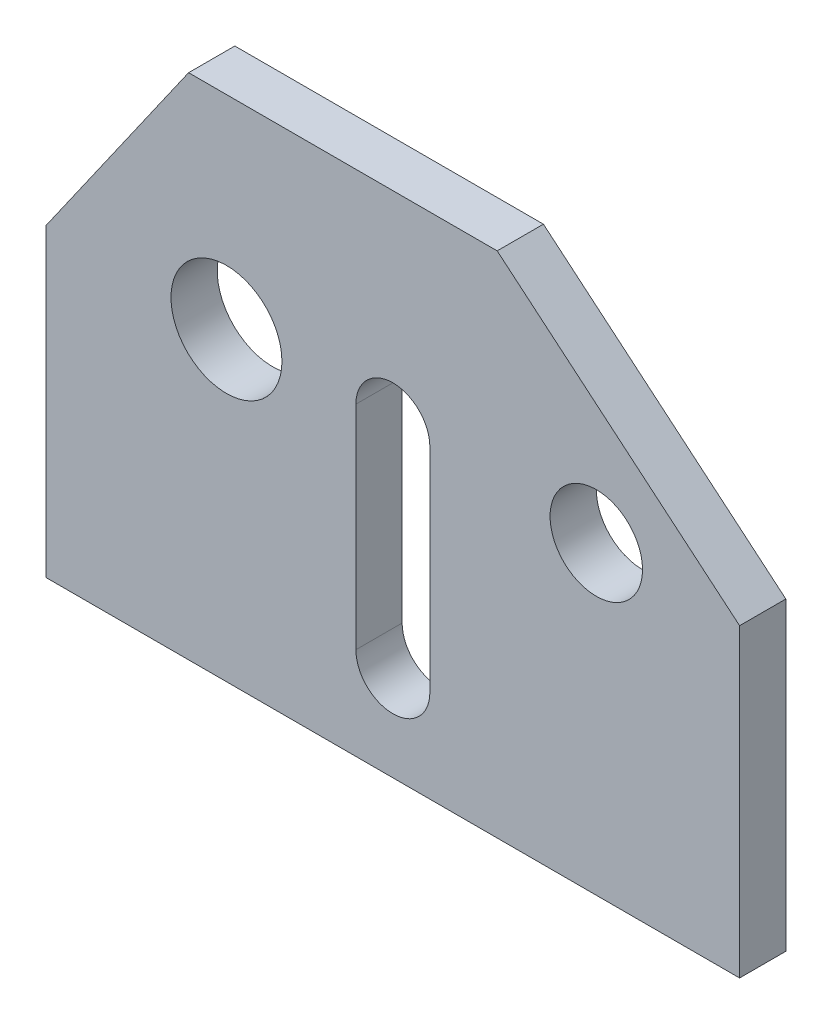
ISO-10303-21;
HEADER;
FILE_DESCRIPTION(('STEP AP214'),'2;1');
FILE_NAME('part.step','',(''),(''),'','','');
FILE_SCHEMA(('AUTOMOTIVE_DESIGN { 1 0 10303 214 1 1 1 1 }'));
ENDSEC;
DATA;
#1=APPLICATION_CONTEXT('core data for automotive mechanical design processes');
#2=APPLICATION_PROTOCOL_DEFINITION('international standard','automotive_design',2000,#1);
#3=PRODUCT_CONTEXT('',#1,'mechanical');
#4=PRODUCT('Part','Part','',(#3));
#5=PRODUCT_RELATED_PRODUCT_CATEGORY('part','',(#4));
#6=PRODUCT_DEFINITION_FORMATION('','',#4);
#7=PRODUCT_DEFINITION_CONTEXT('part definition',#1,'design');
#8=PRODUCT_DEFINITION('design','',#6,#7);
#9=PRODUCT_DEFINITION_SHAPE('','',#8);
#10=(LENGTH_UNIT() NAMED_UNIT(*) SI_UNIT(.MILLI.,.METRE.));
#11=(NAMED_UNIT(*) PLANE_ANGLE_UNIT() SI_UNIT($,.RADIAN.));
#12=(NAMED_UNIT(*) SI_UNIT($,.STERADIAN.) SOLID_ANGLE_UNIT());
#13=UNCERTAINTY_MEASURE_WITH_UNIT(LENGTH_MEASURE(1.E-05),#10,'distance_accuracy_value','');
#14=(GEOMETRIC_REPRESENTATION_CONTEXT(3) GLOBAL_UNCERTAINTY_ASSIGNED_CONTEXT((#13)) GLOBAL_UNIT_ASSIGNED_CONTEXT((#10,
#11,#12)) REPRESENTATION_CONTEXT('',''));
#15=CARTESIAN_POINT('',(0.,0.,0.));
#16=DIRECTION('',(0.,0.,1.));
#17=DIRECTION('',(1.,0.,0.));
#18=AXIS2_PLACEMENT_3D('',#15,#16,#17);
#19=CARTESIAN_POINT('',(0.,0.,5.));
#20=DIRECTION('',(0.,0.,1.));
#21=DIRECTION('',(1.,0.,0.));
#22=AXIS2_PLACEMENT_3D('',#19,#20,#21);
#23=PLANE('',#22);
#24=CARTESIAN_POINT('',(19.5,33.,5.));
#25=DIRECTION('',(0.,0.,1.));
#26=DIRECTION('',(1.,0.,0.));
#27=AXIS2_PLACEMENT_3D('',#24,#25,#26);
#28=CIRCLE('',#27,6.);
#29=CARTESIAN_POINT('',(25.5,33.,5.));
#30=VERTEX_POINT('',#29);
#31=EDGE_CURVE('E158',#30,#30,#28,.T.);
#32=ORIENTED_EDGE('',*,*,#31,.F.);
#33=EDGE_LOOP('',(#32));
#34=FACE_BOUND('',#33,.T.);
#35=DIRECTION('',(0.,-1.,0.));
#36=VECTOR('',#35,1.);
#37=CARTESIAN_POINT('',(0.,0.,5.));
#38=LINE('',#37,#36);
#39=CARTESIAN_POINT('',(0.,33.,5.));
#40=VERTEX_POINT('',#39);
#41=CARTESIAN_POINT('',(0.,0.,5.));
#42=VERTEX_POINT('',#41);
#43=EDGE_CURVE('E168',#40,#42,#38,.T.);
#44=ORIENTED_EDGE('',*,*,#43,.T.);
#45=DIRECTION('',(1.,0.,0.));
#46=VECTOR('',#45,1.);
#47=CARTESIAN_POINT('',(0.,0.,5.));
#48=LINE('',#47,#46);
#49=CARTESIAN_POINT('',(75.,0.,5.));
#50=VERTEX_POINT('',#49);
#51=EDGE_CURVE('E170',#42,#50,#48,.T.);
#52=ORIENTED_EDGE('',*,*,#51,.T.);
#53=DIRECTION('',(0.,1.,0.));
#54=VECTOR('',#53,1.);
#55=CARTESIAN_POINT('',(75.,0.,5.));
#56=LINE('',#55,#54);
#57=CARTESIAN_POINT('',(75.,33.,5.));
#58=VERTEX_POINT('',#57);
#59=EDGE_CURVE('E175',#50,#58,#56,.T.);
#60=ORIENTED_EDGE('',*,*,#59,.T.);
#61=DIRECTION('',(-0.766044443118979,0.642787609686538,0.));
#62=VECTOR('',#61,1.);
#63=CARTESIAN_POINT('',(75.,33.,5.));
#64=LINE('',#63,#62);
#65=CARTESIAN_POINT('',(48.7814209629273,55.,5.));
#66=VERTEX_POINT('',#65);
#67=EDGE_CURVE('E174',#58,#66,#64,.T.);
#68=ORIENTED_EDGE('',*,*,#67,.T.);
#69=DIRECTION('',(-1.,0.,0.));
#70=VECTOR('',#69,1.);
#71=CARTESIAN_POINT('',(48.7814209629273,55.,5.));
#72=LINE('',#71,#70);
#73=CARTESIAN_POINT('',(15.4045658406137,55.,5.));
#74=VERTEX_POINT('',#73);
#75=EDGE_CURVE('E176',#66,#74,#72,.T.);
#76=ORIENTED_EDGE('',*,*,#75,.T.);
#77=DIRECTION('',(-0.573576436351047,-0.819152044288991,0.));
#78=VECTOR('',#77,1.);
#79=CARTESIAN_POINT('',(0.,33.,5.));
#80=LINE('',#79,#78);
#81=EDGE_CURVE('E178',#74,#40,#80,.T.);
#82=ORIENTED_EDGE('',*,*,#81,.T.);
#83=EDGE_LOOP('',(#44,#52,#60,#68,#76,#82));
#84=FACE_BOUND('',#83,.T.);
#85=CARTESIAN_POINT('',(59.5,33.,5.));
#86=DIRECTION('',(0.,0.,1.));
#87=DIRECTION('',(1.,0.,0.));
#88=AXIS2_PLACEMENT_3D('',#85,#86,#87);
#89=CIRCLE('',#88,5.00000000000001);
#90=CARTESIAN_POINT('',(64.5,33.,5.));
#91=VERTEX_POINT('',#90);
#92=EDGE_CURVE('E153',#91,#91,#89,.T.);
#93=ORIENTED_EDGE('',*,*,#92,.F.);
#94=EDGE_LOOP('',(#93));
#95=FACE_BOUND('',#94,.T.);
#96=DIRECTION('',(0.,-1.,0.));
#97=VECTOR('',#96,1.);
#98=CARTESIAN_POINT('',(33.5,33.,5.));
#99=LINE('',#98,#97);
#100=CARTESIAN_POINT('',(33.5,33.,5.));
#101=VERTEX_POINT('',#100);
#102=CARTESIAN_POINT('',(33.5,10.,5.));
#103=VERTEX_POINT('',#102);
#104=EDGE_CURVE('E128',#101,#103,#99,.T.);
#105=ORIENTED_EDGE('',*,*,#104,.F.);
#106=CARTESIAN_POINT('',(37.5,33.,5.));
#107=DIRECTION('',(0.,0.,1.));
#108=DIRECTION('',(1.,0.,0.));
#109=AXIS2_PLACEMENT_3D('',#106,#107,#108);
#110=CIRCLE('',#109,4.00000000000001);
#111=CARTESIAN_POINT('',(41.5,33.,5.));
#112=VERTEX_POINT('',#111);
#113=EDGE_CURVE('E119',#112,#101,#110,.T.);
#114=ORIENTED_EDGE('',*,*,#113,.F.);
#115=DIRECTION('',(0.,1.,0.));
#116=VECTOR('',#115,1.);
#117=CARTESIAN_POINT('',(41.5,33.,5.));
#118=LINE('',#117,#116);
#119=CARTESIAN_POINT('',(41.5,10.,5.));
#120=VERTEX_POINT('',#119);
#121=EDGE_CURVE('E139',#120,#112,#118,.T.);
#122=ORIENTED_EDGE('',*,*,#121,.F.);
#123=CARTESIAN_POINT('',(37.5,10.,5.));
#124=DIRECTION('',(0.,0.,1.));
#125=DIRECTION('',(1.,0.,0.));
#126=AXIS2_PLACEMENT_3D('',#123,#124,#125);
#127=CIRCLE('',#126,4.00000000000001);
#128=EDGE_CURVE('E138',#103,#120,#127,.T.);
#129=ORIENTED_EDGE('',*,*,#128,.F.);
#130=EDGE_LOOP('',(#105,#114,#122,#129));
#131=FACE_BOUND('',#130,.T.);
#132=ADVANCED_FACE('F41',(#34,#84,#95,#131),#23,.T.);
#133=CARTESIAN_POINT('',(0.,0.,0.));
#134=DIRECTION('',(0.,0.,1.));
#135=DIRECTION('',(1.,0.,0.));
#136=AXIS2_PLACEMENT_3D('',#133,#134,#135);
#137=PLANE('',#136);
#138=CARTESIAN_POINT('',(59.5,33.,0.));
#139=DIRECTION('',(0.,0.,1.));
#140=DIRECTION('',(1.,0.,0.));
#141=AXIS2_PLACEMENT_3D('',#138,#139,#140);
#142=CIRCLE('',#141,5.00000000000001);
#143=CARTESIAN_POINT('',(64.5,33.,0.));
#144=VERTEX_POINT('',#143);
#145=EDGE_CURVE('E132',#144,#144,#142,.T.);
#146=ORIENTED_EDGE('',*,*,#145,.T.);
#147=EDGE_LOOP('',(#146));
#148=FACE_BOUND('',#147,.T.);
#149=CARTESIAN_POINT('',(19.5,33.,0.));
#150=DIRECTION('',(0.,0.,1.));
#151=DIRECTION('',(1.,0.,0.));
#152=AXIS2_PLACEMENT_3D('',#149,#150,#151);
#153=CIRCLE('',#152,6.);
#154=CARTESIAN_POINT('',(25.5,33.,0.));
#155=VERTEX_POINT('',#154);
#156=EDGE_CURVE('E160',#155,#155,#153,.T.);
#157=ORIENTED_EDGE('',*,*,#156,.T.);
#158=EDGE_LOOP('',(#157));
#159=FACE_BOUND('',#158,.T.);
#160=DIRECTION('',(0.,-1.,0.));
#161=VECTOR('',#160,1.);
#162=CARTESIAN_POINT('',(0.,0.,0.));
#163=LINE('',#162,#161);
#164=CARTESIAN_POINT('',(0.,33.,0.));
#165=VERTEX_POINT('',#164);
#166=CARTESIAN_POINT('',(0.,0.,0.));
#167=VERTEX_POINT('',#166);
#168=EDGE_CURVE('E164',#165,#167,#163,.T.);
#169=ORIENTED_EDGE('',*,*,#168,.F.);
#170=DIRECTION('',(-0.573576436351047,-0.819152044288991,0.));
#171=VECTOR('',#170,1.);
#172=CARTESIAN_POINT('',(0.,33.,0.));
#173=LINE('',#172,#171);
#174=CARTESIAN_POINT('',(15.4045658406137,55.,0.));
#175=VERTEX_POINT('',#174);
#176=EDGE_CURVE('E169',#175,#165,#173,.T.);
#177=ORIENTED_EDGE('',*,*,#176,.F.);
#178=DIRECTION('',(-1.,0.,0.));
#179=VECTOR('',#178,1.);
#180=CARTESIAN_POINT('',(48.7814209629273,55.,0.));
#181=LINE('',#180,#179);
#182=CARTESIAN_POINT('',(48.7814209629273,55.,0.));
#183=VERTEX_POINT('',#182);
#184=EDGE_CURVE('E188',#183,#175,#181,.T.);
#185=ORIENTED_EDGE('',*,*,#184,.F.);
#186=DIRECTION('',(-0.766044443118979,0.642787609686538,0.));
#187=VECTOR('',#186,1.);
#188=CARTESIAN_POINT('',(75.,33.,0.));
#189=LINE('',#188,#187);
#190=CARTESIAN_POINT('',(75.,33.,0.));
#191=VERTEX_POINT('',#190);
#192=EDGE_CURVE('E190',#191,#183,#189,.T.);
#193=ORIENTED_EDGE('',*,*,#192,.F.);
#194=DIRECTION('',(0.,1.,0.));
#195=VECTOR('',#194,1.);
#196=CARTESIAN_POINT('',(75.,0.,0.));
#197=LINE('',#196,#195);
#198=CARTESIAN_POINT('',(75.,0.,0.));
#199=VERTEX_POINT('',#198);
#200=EDGE_CURVE('E184',#199,#191,#197,.T.);
#201=ORIENTED_EDGE('',*,*,#200,.F.);
#202=DIRECTION('',(1.,0.,0.));
#203=VECTOR('',#202,1.);
#204=CARTESIAN_POINT('',(0.,0.,0.));
#205=LINE('',#204,#203);
#206=EDGE_CURVE('E183',#167,#199,#205,.T.);
#207=ORIENTED_EDGE('',*,*,#206,.F.);
#208=EDGE_LOOP('',(#169,#177,#185,#193,#201,#207));
#209=FACE_BOUND('',#208,.T.);
#210=CARTESIAN_POINT('',(37.5,33.,0.));
#211=DIRECTION('',(0.,0.,1.));
#212=DIRECTION('',(1.,0.,0.));
#213=AXIS2_PLACEMENT_3D('',#210,#211,#212);
#214=CIRCLE('',#213,4.00000000000001);
#215=CARTESIAN_POINT('',(41.5,33.,0.));
#216=VERTEX_POINT('',#215);
#217=CARTESIAN_POINT('',(33.5,33.,0.));
#218=VERTEX_POINT('',#217);
#219=EDGE_CURVE('E63',#216,#218,#214,.T.);
#220=ORIENTED_EDGE('',*,*,#219,.T.);
#221=DIRECTION('',(0.,-1.,0.));
#222=VECTOR('',#221,1.);
#223=CARTESIAN_POINT('',(33.5,33.,0.));
#224=LINE('',#223,#222);
#225=CARTESIAN_POINT('',(33.5,10.,0.));
#226=VERTEX_POINT('',#225);
#227=EDGE_CURVE('E133',#218,#226,#224,.T.);
#228=ORIENTED_EDGE('',*,*,#227,.T.);
#229=CARTESIAN_POINT('',(37.5,10.,0.));
#230=DIRECTION('',(0.,0.,1.));
#231=DIRECTION('',(1.,0.,0.));
#232=AXIS2_PLACEMENT_3D('',#229,#230,#231);
#233=CIRCLE('',#232,4.00000000000001);
#234=CARTESIAN_POINT('',(41.5,10.,0.));
#235=VERTEX_POINT('',#234);
#236=EDGE_CURVE('E147',#226,#235,#233,.T.);
#237=ORIENTED_EDGE('',*,*,#236,.T.);
#238=DIRECTION('',(0.,1.,0.));
#239=VECTOR('',#238,1.);
#240=CARTESIAN_POINT('',(41.5,33.,0.));
#241=LINE('',#240,#239);
#242=EDGE_CURVE('E130',#235,#216,#241,.T.);
#243=ORIENTED_EDGE('',*,*,#242,.T.);
#244=EDGE_LOOP('',(#220,#228,#237,#243));
#245=FACE_BOUND('',#244,.T.);
#246=ADVANCED_FACE('F211',(#148,#159,#209,#245),#137,.F.);
#247=CARTESIAN_POINT('',(0.,0.,5.));
#248=DIRECTION('',(1.,0.,0.));
#249=DIRECTION('',(0.,0.,-1.));
#250=AXIS2_PLACEMENT_3D('',#247,#248,#249);
#251=PLANE('',#250);
#252=ORIENTED_EDGE('',*,*,#168,.T.);
#253=DIRECTION('',(0.,0.,-1.));
#254=VECTOR('',#253,1.);
#255=CARTESIAN_POINT('',(0.,0.,5.));
#256=LINE('',#255,#254);
#257=EDGE_CURVE('E11',#42,#167,#256,.T.);
#258=ORIENTED_EDGE('',*,*,#257,.F.);
#259=ORIENTED_EDGE('',*,*,#43,.F.);
#260=DIRECTION('',(0.,0.,-1.));
#261=VECTOR('',#260,1.);
#262=CARTESIAN_POINT('',(0.,33.,5.));
#263=LINE('',#262,#261);
#264=EDGE_CURVE('E179',#40,#165,#263,.T.);
#265=ORIENTED_EDGE('',*,*,#264,.T.);
#266=EDGE_LOOP('',(#252,#258,#259,#265));
#267=FACE_BOUND('',#266,.T.);
#268=ADVANCED_FACE('F43',(#267),#251,.F.);
#269=CARTESIAN_POINT('',(0.,0.,5.));
#270=DIRECTION('',(0.,1.,0.));
#271=DIRECTION('',(0.,0.,1.));
#272=AXIS2_PLACEMENT_3D('',#269,#270,#271);
#273=PLANE('',#272);
#274=ORIENTED_EDGE('',*,*,#206,.T.);
#275=DIRECTION('',(0.,0.,-1.));
#276=VECTOR('',#275,1.);
#277=CARTESIAN_POINT('',(75.,0.,5.));
#278=LINE('',#277,#276);
#279=EDGE_CURVE('E47',#50,#199,#278,.T.);
#280=ORIENTED_EDGE('',*,*,#279,.F.);
#281=ORIENTED_EDGE('',*,*,#51,.F.);
#282=ORIENTED_EDGE('',*,*,#257,.T.);
#283=EDGE_LOOP('',(#274,#280,#281,#282));
#284=FACE_BOUND('',#283,.T.);
#285=ADVANCED_FACE('F231',(#284),#273,.F.);
#286=CARTESIAN_POINT('',(75.,0.,5.));
#287=DIRECTION('',(-1.,0.,0.));
#288=DIRECTION('',(0.,0.,1.));
#289=AXIS2_PLACEMENT_3D('',#286,#287,#288);
#290=PLANE('',#289);
#291=ORIENTED_EDGE('',*,*,#200,.T.);
#292=DIRECTION('',(0.,0.,-1.));
#293=VECTOR('',#292,1.);
#294=CARTESIAN_POINT('',(75.,33.,5.));
#295=LINE('',#294,#293);
#296=EDGE_CURVE('E200',#58,#191,#295,.T.);
#297=ORIENTED_EDGE('',*,*,#296,.F.);
#298=ORIENTED_EDGE('',*,*,#59,.F.);
#299=ORIENTED_EDGE('',*,*,#279,.T.);
#300=EDGE_LOOP('',(#291,#297,#298,#299));
#301=FACE_BOUND('',#300,.T.);
#302=ADVANCED_FACE('F207',(#301),#290,.F.);
#303=CARTESIAN_POINT('',(75.,33.,5.));
#304=DIRECTION('',(-0.642787609686538,-0.766044443118979,0.));
#305=DIRECTION('',(0.766044443118979,-0.642787609686538,0.));
#306=AXIS2_PLACEMENT_3D('',#303,#304,#305);
#307=PLANE('',#306);
#308=ORIENTED_EDGE('',*,*,#192,.T.);
#309=DIRECTION('',(0.,0.,-1.));
#310=VECTOR('',#309,1.);
#311=CARTESIAN_POINT('',(48.7814209629273,55.,5.));
#312=LINE('',#311,#310);
#313=EDGE_CURVE('E197',#66,#183,#312,.T.);
#314=ORIENTED_EDGE('',*,*,#313,.F.);
#315=ORIENTED_EDGE('',*,*,#67,.F.);
#316=ORIENTED_EDGE('',*,*,#296,.T.);
#317=EDGE_LOOP('',(#308,#314,#315,#316));
#318=FACE_BOUND('',#317,.T.);
#319=ADVANCED_FACE('F219',(#318),#307,.F.);
#320=CARTESIAN_POINT('',(48.7814209629273,55.,5.));
#321=DIRECTION('',(0.,-1.,0.));
#322=DIRECTION('',(1.,0.,0.));
#323=AXIS2_PLACEMENT_3D('',#320,#321,#322);
#324=PLANE('',#323);
#325=ORIENTED_EDGE('',*,*,#184,.T.);
#326=DIRECTION('',(0.,0.,-1.));
#327=VECTOR('',#326,1.);
#328=CARTESIAN_POINT('',(15.4045658406137,55.,5.));
#329=LINE('',#328,#327);
#330=EDGE_CURVE('E191',#74,#175,#329,.T.);
#331=ORIENTED_EDGE('',*,*,#330,.F.);
#332=ORIENTED_EDGE('',*,*,#75,.F.);
#333=ORIENTED_EDGE('',*,*,#313,.T.);
#334=EDGE_LOOP('',(#325,#331,#332,#333));
#335=FACE_BOUND('',#334,.T.);
#336=ADVANCED_FACE('F223',(#335),#324,.F.);
#337=CARTESIAN_POINT('',(0.,33.,5.));
#338=DIRECTION('',(0.819152044288991,-0.573576436351047,0.));
#339=DIRECTION('',(0.573576436351047,0.819152044288991,0.));
#340=AXIS2_PLACEMENT_3D('',#337,#338,#339);
#341=PLANE('',#340);
#342=ORIENTED_EDGE('',*,*,#176,.T.);
#343=ORIENTED_EDGE('',*,*,#264,.F.);
#344=ORIENTED_EDGE('',*,*,#81,.F.);
#345=ORIENTED_EDGE('',*,*,#330,.T.);
#346=EDGE_LOOP('',(#342,#343,#344,#345));
#347=FACE_BOUND('',#346,.T.);
#348=ADVANCED_FACE('F233',(#347),#341,.F.);
#349=CARTESIAN_POINT('',(19.5,33.,5.));
#350=DIRECTION('',(0.,0.,-1.));
#351=DIRECTION('',(-1.,0.,0.));
#352=AXIS2_PLACEMENT_3D('',#349,#350,#351);
#353=CYLINDRICAL_SURFACE('',#352,6.);
#354=ORIENTED_EDGE('',*,*,#31,.T.);
#355=EDGE_LOOP('',(#354));
#356=FACE_BOUND('',#355,.T.);
#357=ORIENTED_EDGE('',*,*,#156,.F.);
#358=EDGE_LOOP('',(#357));
#359=FACE_BOUND('',#358,.T.);
#360=ADVANCED_FACE('F237',(#356,#359),#353,.F.);
#361=CARTESIAN_POINT('',(59.5,33.,5.));
#362=DIRECTION('',(0.,0.,-1.));
#363=DIRECTION('',(-1.,0.,0.));
#364=AXIS2_PLACEMENT_3D('',#361,#362,#363);
#365=CYLINDRICAL_SURFACE('',#364,5.00000000000001);
#366=ORIENTED_EDGE('',*,*,#92,.T.);
#367=EDGE_LOOP('',(#366));
#368=FACE_BOUND('',#367,.T.);
#369=ORIENTED_EDGE('',*,*,#145,.F.);
#370=EDGE_LOOP('',(#369));
#371=FACE_BOUND('',#370,.T.);
#372=ADVANCED_FACE('F242',(#368,#371),#365,.F.);
#373=CARTESIAN_POINT('',(37.5,33.,5.));
#374=DIRECTION('',(0.,0.,-1.));
#375=DIRECTION('',(-1.,0.,0.));
#376=AXIS2_PLACEMENT_3D('',#373,#374,#375);
#377=CYLINDRICAL_SURFACE('',#376,4.00000000000001);
#378=ORIENTED_EDGE('',*,*,#219,.F.);
#379=DIRECTION('',(0.,0.,-1.));
#380=VECTOR('',#379,1.);
#381=CARTESIAN_POINT('',(41.5,33.,5.));
#382=LINE('',#381,#380);
#383=EDGE_CURVE('E122',#112,#216,#382,.T.);
#384=ORIENTED_EDGE('',*,*,#383,.F.);
#385=ORIENTED_EDGE('',*,*,#113,.T.);
#386=DIRECTION('',(0.,0.,-1.));
#387=VECTOR('',#386,1.);
#388=CARTESIAN_POINT('',(33.5,33.,5.));
#389=LINE('',#388,#387);
#390=EDGE_CURVE('E123',#101,#218,#389,.T.);
#391=ORIENTED_EDGE('',*,*,#390,.T.);
#392=EDGE_LOOP('',(#378,#384,#385,#391));
#393=FACE_BOUND('',#392,.T.);
#394=ADVANCED_FACE('F120',(#393),#377,.F.);
#395=CARTESIAN_POINT('',(33.5,33.,5.));
#396=DIRECTION('',(1.,0.,0.));
#397=DIRECTION('',(0.,0.,-1.));
#398=AXIS2_PLACEMENT_3D('',#395,#396,#397);
#399=PLANE('',#398);
#400=ORIENTED_EDGE('',*,*,#227,.F.);
#401=ORIENTED_EDGE('',*,*,#390,.F.);
#402=ORIENTED_EDGE('',*,*,#104,.T.);
#403=DIRECTION('',(0.,0.,-1.));
#404=VECTOR('',#403,1.);
#405=CARTESIAN_POINT('',(33.5,10.,5.));
#406=LINE('',#405,#404);
#407=EDGE_CURVE('E134',#103,#226,#406,.T.);
#408=ORIENTED_EDGE('',*,*,#407,.T.);
#409=EDGE_LOOP('',(#400,#401,#402,#408));
#410=FACE_BOUND('',#409,.T.);
#411=ADVANCED_FACE('F127',(#410),#399,.T.);
#412=CARTESIAN_POINT('',(37.5,10.,5.));
#413=DIRECTION('',(0.,0.,-1.));
#414=DIRECTION('',(-1.,0.,0.));
#415=AXIS2_PLACEMENT_3D('',#412,#413,#414);
#416=CYLINDRICAL_SURFACE('',#415,4.00000000000001);
#417=ORIENTED_EDGE('',*,*,#236,.F.);
#418=ORIENTED_EDGE('',*,*,#407,.F.);
#419=ORIENTED_EDGE('',*,*,#128,.T.);
#420=DIRECTION('',(0.,0.,-1.));
#421=VECTOR('',#420,1.);
#422=CARTESIAN_POINT('',(41.5,10.,5.));
#423=LINE('',#422,#421);
#424=EDGE_CURVE('E57',#120,#235,#423,.T.);
#425=ORIENTED_EDGE('',*,*,#424,.T.);
#426=EDGE_LOOP('',(#417,#418,#419,#425));
#427=FACE_BOUND('',#426,.T.);
#428=ADVANCED_FACE('F261',(#427),#416,.F.);
#429=CARTESIAN_POINT('',(41.5,33.,5.));
#430=DIRECTION('',(-1.,0.,0.));
#431=DIRECTION('',(0.,0.,1.));
#432=AXIS2_PLACEMENT_3D('',#429,#430,#431);
#433=PLANE('',#432);
#434=ORIENTED_EDGE('',*,*,#242,.F.);
#435=ORIENTED_EDGE('',*,*,#424,.F.);
#436=ORIENTED_EDGE('',*,*,#121,.T.);
#437=ORIENTED_EDGE('',*,*,#383,.T.);
#438=EDGE_LOOP('',(#434,#435,#436,#437));
#439=FACE_BOUND('',#438,.T.);
#440=ADVANCED_FACE('F266',(#439),#433,.T.);
#441=CLOSED_SHELL('',(#132,#246,#268,#285,#302,#319,#336,#348,#360,#372,#394,#411,#428,#440));
#442=MANIFOLD_SOLID_BREP('B2',#441);
#443=ADVANCED_BREP_SHAPE_REPRESENTATION('',(#18,#442),#14);
#444=SHAPE_DEFINITION_REPRESENTATION(#9,#443);
ENDSEC;
END-ISO-10303-21;
